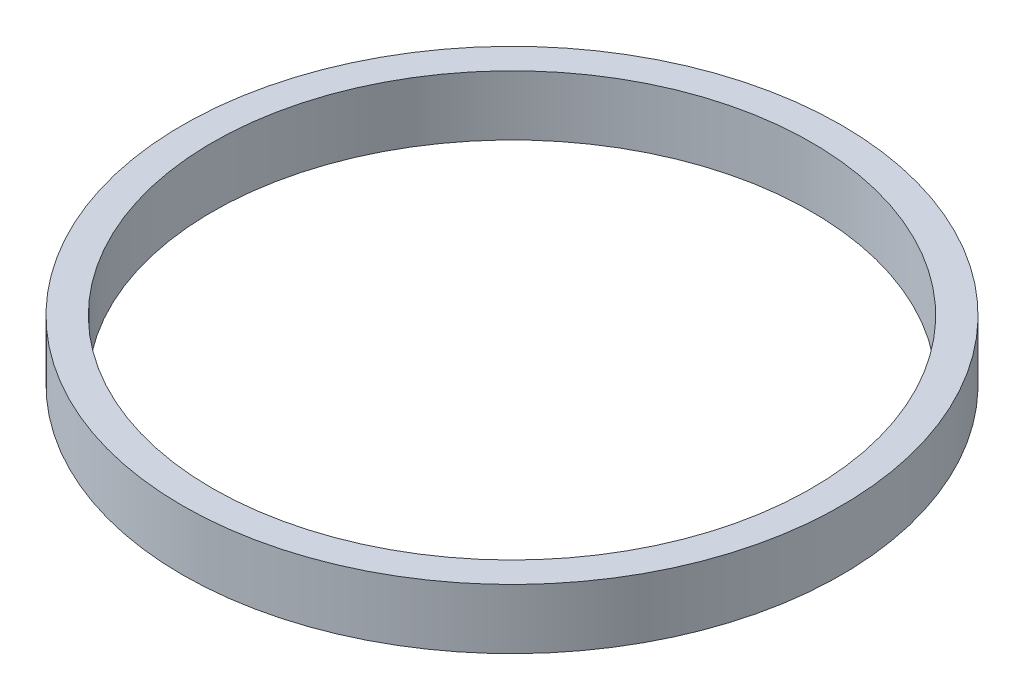
ISO-10303-21;
HEADER;
FILE_DESCRIPTION(('STEP AP214'),'2;1');
FILE_NAME('part.step','',(''),(''),'','','');
FILE_SCHEMA(('AUTOMOTIVE_DESIGN { 1 0 10303 214 1 1 1 1 }'));
ENDSEC;
DATA;
#1=APPLICATION_CONTEXT('core data for automotive mechanical design processes');
#2=APPLICATION_PROTOCOL_DEFINITION('international standard','automotive_design',2000,#1);
#3=PRODUCT_CONTEXT('',#1,'mechanical');
#4=PRODUCT('Part','Part','',(#3));
#5=PRODUCT_RELATED_PRODUCT_CATEGORY('part','',(#4));
#6=PRODUCT_DEFINITION_FORMATION('','',#4);
#7=PRODUCT_DEFINITION_CONTEXT('part definition',#1,'design');
#8=PRODUCT_DEFINITION('design','',#6,#7);
#9=PRODUCT_DEFINITION_SHAPE('','',#8);
#10=(LENGTH_UNIT() NAMED_UNIT(*) SI_UNIT(.MILLI.,.METRE.));
#11=(NAMED_UNIT(*) PLANE_ANGLE_UNIT() SI_UNIT($,.RADIAN.));
#12=(NAMED_UNIT(*) SI_UNIT($,.STERADIAN.) SOLID_ANGLE_UNIT());
#13=UNCERTAINTY_MEASURE_WITH_UNIT(LENGTH_MEASURE(1.E-05),#10,'distance_accuracy_value','');
#14=(GEOMETRIC_REPRESENTATION_CONTEXT(3) GLOBAL_UNCERTAINTY_ASSIGNED_CONTEXT((#13)) GLOBAL_UNIT_ASSIGNED_CONTEXT((#10,
#11,#12)) REPRESENTATION_CONTEXT('',''));
#15=CARTESIAN_POINT('',(0.,0.,0.));
#16=DIRECTION('',(0.,0.,1.));
#17=DIRECTION('',(1.,0.,0.));
#18=AXIS2_PLACEMENT_3D('',#15,#16,#17);
#19=CARTESIAN_POINT('',(0.,6.,0.));
#20=DIRECTION('',(0.,1.,0.));
#21=DIRECTION('',(0.,0.,1.));
#22=AXIS2_PLACEMENT_3D('',#19,#20,#21);
#23=PLANE('',#22);
#24=CARTESIAN_POINT('',(0.,6.,0.));
#25=DIRECTION('',(0.,1.,0.));
#26=DIRECTION('',(0.,0.,1.));
#27=AXIS2_PLACEMENT_3D('',#24,#25,#26);
#28=CIRCLE('',#27,33.);
#29=CARTESIAN_POINT('',(0.,6.,33.));
#30=VERTEX_POINT('',#29);
#31=EDGE_CURVE('E10',#30,#30,#28,.T.);
#32=ORIENTED_EDGE('',*,*,#31,.T.);
#33=EDGE_LOOP('',(#32));
#34=FACE_BOUND('',#33,.T.);
#35=CARTESIAN_POINT('',(0.,6.,0.));
#36=DIRECTION('',(0.,1.,0.));
#37=DIRECTION('',(0.,0.,1.));
#38=AXIS2_PLACEMENT_3D('',#35,#36,#37);
#39=CIRCLE('',#38,30.);
#40=CARTESIAN_POINT('',(0.,6.,30.));
#41=VERTEX_POINT('',#40);
#42=EDGE_CURVE('E52',#41,#41,#39,.T.);
#43=ORIENTED_EDGE('',*,*,#42,.F.);
#44=EDGE_LOOP('',(#43));
#45=FACE_BOUND('',#44,.T.);
#46=ADVANCED_FACE('F39',(#34,#45),#23,.T.);
#47=CARTESIAN_POINT('',(0.,0.,0.));
#48=DIRECTION('',(0.,1.,0.));
#49=DIRECTION('',(0.,0.,1.));
#50=AXIS2_PLACEMENT_3D('',#47,#48,#49);
#51=PLANE('',#50);
#52=CARTESIAN_POINT('',(0.,0.,0.));
#53=DIRECTION('',(0.,1.,0.));
#54=DIRECTION('',(0.,0.,1.));
#55=AXIS2_PLACEMENT_3D('',#52,#53,#54);
#56=CIRCLE('',#55,33.);
#57=CARTESIAN_POINT('',(0.,0.,33.));
#58=VERTEX_POINT('',#57);
#59=EDGE_CURVE('E43',#58,#58,#56,.T.);
#60=ORIENTED_EDGE('',*,*,#59,.F.);
#61=EDGE_LOOP('',(#60));
#62=FACE_BOUND('',#61,.T.);
#63=CARTESIAN_POINT('',(0.,0.,0.));
#64=DIRECTION('',(0.,1.,0.));
#65=DIRECTION('',(0.,0.,1.));
#66=AXIS2_PLACEMENT_3D('',#63,#64,#65);
#67=CIRCLE('',#66,30.);
#68=CARTESIAN_POINT('',(0.,0.,30.));
#69=VERTEX_POINT('',#68);
#70=EDGE_CURVE('E54',#69,#69,#67,.T.);
#71=ORIENTED_EDGE('',*,*,#70,.T.);
#72=EDGE_LOOP('',(#71));
#73=FACE_BOUND('',#72,.T.);
#74=ADVANCED_FACE('F66',(#62,#73),#51,.F.);
#75=CARTESIAN_POINT('',(0.,6.,0.));
#76=DIRECTION('',(0.,-1.,0.));
#77=DIRECTION('',(0.,0.,-1.));
#78=AXIS2_PLACEMENT_3D('',#75,#76,#77);
#79=CYLINDRICAL_SURFACE('',#78,33.);
#80=ORIENTED_EDGE('',*,*,#31,.F.);
#81=EDGE_LOOP('',(#80));
#82=FACE_BOUND('',#81,.T.);
#83=ORIENTED_EDGE('',*,*,#59,.T.);
#84=EDGE_LOOP('',(#83));
#85=FACE_BOUND('',#84,.T.);
#86=ADVANCED_FACE('F41',(#82,#85),#79,.T.);
#87=CARTESIAN_POINT('',(0.,6.,0.));
#88=DIRECTION('',(0.,-1.,0.));
#89=DIRECTION('',(0.,0.,-1.));
#90=AXIS2_PLACEMENT_3D('',#87,#88,#89);
#91=CYLINDRICAL_SURFACE('',#90,30.);
#92=ORIENTED_EDGE('',*,*,#42,.T.);
#93=EDGE_LOOP('',(#92));
#94=FACE_BOUND('',#93,.T.);
#95=ORIENTED_EDGE('',*,*,#70,.F.);
#96=EDGE_LOOP('',(#95));
#97=FACE_BOUND('',#96,.T.);
#98=ADVANCED_FACE('F62',(#94,#97),#91,.F.);
#99=CLOSED_SHELL('',(#46,#74,#86,#98));
#100=MANIFOLD_SOLID_BREP('B2',#99);
#101=ADVANCED_BREP_SHAPE_REPRESENTATION('',(#18,#100),#14);
#102=SHAPE_DEFINITION_REPRESENTATION(#9,#101);
ENDSEC;
END-ISO-10303-21;
